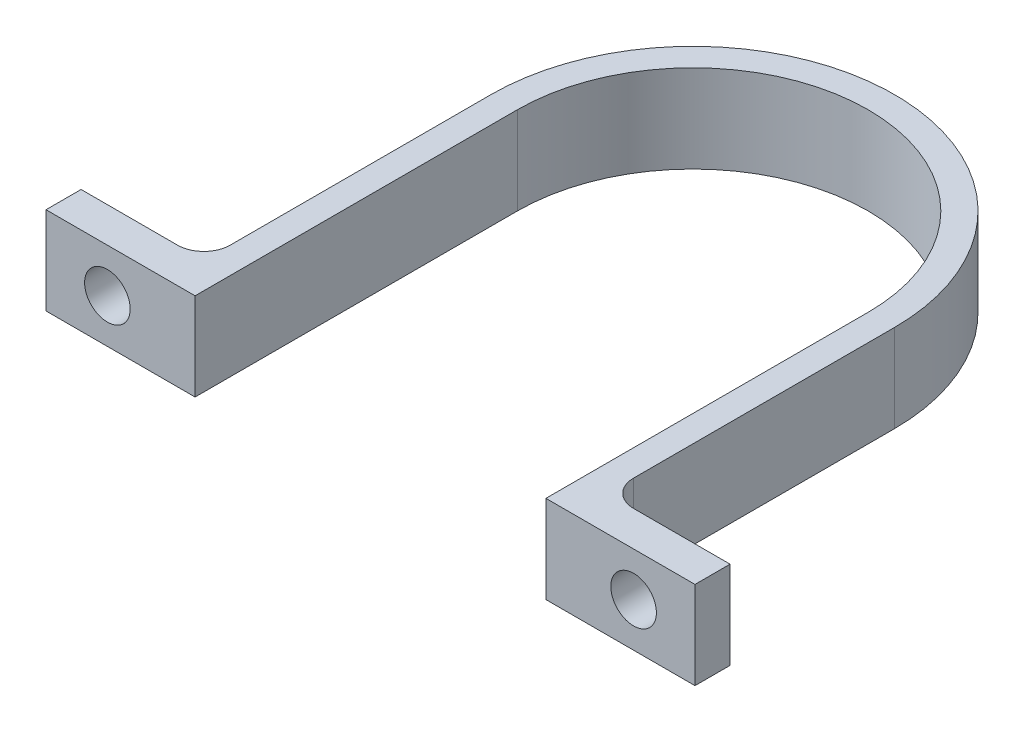
ISO-10303-21;
HEADER;
FILE_DESCRIPTION(('STEP AP214'),'2;1');
FILE_NAME('part.step','',(''),(''),'','','');
FILE_SCHEMA(('AUTOMOTIVE_DESIGN { 1 0 10303 214 1 1 1 1 }'));
ENDSEC;
DATA;
#1=APPLICATION_CONTEXT('core data for automotive mechanical design processes');
#2=APPLICATION_PROTOCOL_DEFINITION('international standard','automotive_design',2000,#1);
#3=PRODUCT_CONTEXT('',#1,'mechanical');
#4=PRODUCT('Part','Part','',(#3));
#5=PRODUCT_RELATED_PRODUCT_CATEGORY('part','',(#4));
#6=PRODUCT_DEFINITION_FORMATION('','',#4);
#7=PRODUCT_DEFINITION_CONTEXT('part definition',#1,'design');
#8=PRODUCT_DEFINITION('design','',#6,#7);
#9=PRODUCT_DEFINITION_SHAPE('','',#8);
#10=(LENGTH_UNIT() NAMED_UNIT(*) SI_UNIT(.MILLI.,.METRE.));
#11=(NAMED_UNIT(*) PLANE_ANGLE_UNIT() SI_UNIT($,.RADIAN.));
#12=(NAMED_UNIT(*) SI_UNIT($,.STERADIAN.) SOLID_ANGLE_UNIT());
#13=UNCERTAINTY_MEASURE_WITH_UNIT(LENGTH_MEASURE(1.E-05),#10,'distance_accuracy_value','');
#14=(GEOMETRIC_REPRESENTATION_CONTEXT(3) GLOBAL_UNCERTAINTY_ASSIGNED_CONTEXT((#13)) GLOBAL_UNIT_ASSIGNED_CONTEXT((#10,
#11,#12)) REPRESENTATION_CONTEXT('',''));
#15=CARTESIAN_POINT('',(0.,0.,0.));
#16=DIRECTION('',(0.,0.,1.));
#17=DIRECTION('',(1.,0.,0.));
#18=AXIS2_PLACEMENT_3D('',#15,#16,#17);
#19=CARTESIAN_POINT('',(23.,10.,0.));
#20=DIRECTION('',(-1.,0.,0.));
#21=DIRECTION('',(0.,0.,1.));
#22=AXIS2_PLACEMENT_3D('',#19,#20,#21);
#23=PLANE('',#22);
#24=DIRECTION('',(0.,0.,-1.));
#25=VECTOR('',#24,1.);
#26=CARTESIAN_POINT('',(23.,10.,0.));
#27=LINE('',#26,#25);
#28=CARTESIAN_POINT('',(23.,10.,29.75));
#29=VERTEX_POINT('',#28);
#30=CARTESIAN_POINT('',(23.,10.,0.));
#31=VERTEX_POINT('',#30);
#32=EDGE_CURVE('E148',#29,#31,#27,.T.);
#33=ORIENTED_EDGE('',*,*,#32,.F.);
#34=DIRECTION('',(0.,-1.,0.));
#35=VECTOR('',#34,1.);
#36=CARTESIAN_POINT('',(23.,0.,29.75));
#37=LINE('',#36,#35);
#38=CARTESIAN_POINT('',(23.,0.,29.75));
#39=VERTEX_POINT('',#38);
#40=EDGE_CURVE('E247',#29,#39,#37,.T.);
#41=ORIENTED_EDGE('',*,*,#40,.T.);
#42=DIRECTION('',(0.,0.,-1.));
#43=VECTOR('',#42,1.);
#44=CARTESIAN_POINT('',(23.,0.,0.));
#45=LINE('',#44,#43);
#46=CARTESIAN_POINT('',(23.,0.,0.));
#47=VERTEX_POINT('',#46);
#48=EDGE_CURVE('E221',#39,#47,#45,.T.);
#49=ORIENTED_EDGE('',*,*,#48,.T.);
#50=DIRECTION('',(0.,-1.,0.));
#51=VECTOR('',#50,1.);
#52=CARTESIAN_POINT('',(23.,10.,0.));
#53=LINE('',#52,#51);
#54=EDGE_CURVE('E239',#31,#47,#53,.T.);
#55=ORIENTED_EDGE('',*,*,#54,.F.);
#56=EDGE_LOOP('',(#33,#41,#49,#55));
#57=FACE_BOUND('',#56,.T.);
#58=ADVANCED_FACE('F38',(#57),#23,.F.);
#59=CARTESIAN_POINT('',(0.,10.,0.));
#60=DIRECTION('',(0.,-1.,0.));
#61=DIRECTION('',(0.,0.,-1.));
#62=AXIS2_PLACEMENT_3D('',#59,#60,#61);
#63=CYLINDRICAL_SURFACE('',#62,20.);
#64=CARTESIAN_POINT('',(0.,0.,0.));
#65=DIRECTION('',(0.,-1.,0.));
#66=DIRECTION('',(0.,0.,1.));
#67=AXIS2_PLACEMENT_3D('',#64,#65,#66);
#68=CIRCLE('',#67,20.);
#69=CARTESIAN_POINT('',(-20.,0.,0.));
#70=VERTEX_POINT('',#69);
#71=CARTESIAN_POINT('',(20.,0.,0.));
#72=VERTEX_POINT('',#71);
#73=EDGE_CURVE('E199',#70,#72,#68,.T.);
#74=ORIENTED_EDGE('',*,*,#73,.T.);
#75=DIRECTION('',(0.,-1.,0.));
#76=VECTOR('',#75,1.);
#77=CARTESIAN_POINT('',(20.,10.,0.));
#78=LINE('',#77,#76);
#79=CARTESIAN_POINT('',(20.,10.,0.));
#80=VERTEX_POINT('',#79);
#81=EDGE_CURVE('E244',#80,#72,#78,.T.);
#82=ORIENTED_EDGE('',*,*,#81,.F.);
#83=CARTESIAN_POINT('',(0.,10.,0.));
#84=DIRECTION('',(0.,-1.,0.));
#85=DIRECTION('',(0.,0.,1.));
#86=AXIS2_PLACEMENT_3D('',#83,#84,#85);
#87=CIRCLE('',#86,20.);
#88=CARTESIAN_POINT('',(-20.,10.,0.));
#89=VERTEX_POINT('',#88);
#90=EDGE_CURVE('E202',#89,#80,#87,.T.);
#91=ORIENTED_EDGE('',*,*,#90,.F.);
#92=DIRECTION('',(0.,-1.,0.));
#93=VECTOR('',#92,1.);
#94=CARTESIAN_POINT('',(-20.,10.,0.));
#95=LINE('',#94,#93);
#96=EDGE_CURVE('E215',#89,#70,#95,.T.);
#97=ORIENTED_EDGE('',*,*,#96,.T.);
#98=EDGE_LOOP('',(#74,#82,#91,#97));
#99=FACE_BOUND('',#98,.T.);
#100=ADVANCED_FACE('F289',(#99),#63,.F.);
#101=CARTESIAN_POINT('',(20.,10.,0.));
#102=DIRECTION('',(1.,0.,0.));
#103=DIRECTION('',(0.,0.,-1.));
#104=AXIS2_PLACEMENT_3D('',#101,#102,#103);
#105=PLANE('',#104);
#106=DIRECTION('',(0.,0.,1.));
#107=VECTOR('',#106,1.);
#108=CARTESIAN_POINT('',(20.,0.,0.));
#109=LINE('',#108,#107);
#110=CARTESIAN_POINT('',(20.,0.,36.75));
#111=VERTEX_POINT('',#110);
#112=EDGE_CURVE('E218',#72,#111,#109,.T.);
#113=ORIENTED_EDGE('',*,*,#112,.T.);
#114=DIRECTION('',(0.,-1.,0.));
#115=VECTOR('',#114,1.);
#116=CARTESIAN_POINT('',(20.,10.,36.75));
#117=LINE('',#116,#115);
#118=CARTESIAN_POINT('',(20.,10.,36.75));
#119=VERTEX_POINT('',#118);
#120=EDGE_CURVE('E242',#119,#111,#117,.T.);
#121=ORIENTED_EDGE('',*,*,#120,.F.);
#122=DIRECTION('',(0.,0.,1.));
#123=VECTOR('',#122,1.);
#124=CARTESIAN_POINT('',(20.,10.,0.));
#125=LINE('',#124,#123);
#126=EDGE_CURVE('E143',#80,#119,#125,.T.);
#127=ORIENTED_EDGE('',*,*,#126,.F.);
#128=ORIENTED_EDGE('',*,*,#81,.T.);
#129=EDGE_LOOP('',(#113,#121,#127,#128));
#130=FACE_BOUND('',#129,.T.);
#131=ADVANCED_FACE('F294',(#130),#105,.F.);
#132=CARTESIAN_POINT('',(20.,10.,36.75));
#133=DIRECTION('',(0.,0.,-1.));
#134=DIRECTION('',(-1.,0.,0.));
#135=AXIS2_PLACEMENT_3D('',#132,#133,#134);
#136=PLANE('',#135);
#137=DIRECTION('',(1.,0.,0.));
#138=VECTOR('',#137,1.);
#139=CARTESIAN_POINT('',(20.,0.,36.75));
#140=LINE('',#139,#138);
#141=CARTESIAN_POINT('',(37.,0.,36.75));
#142=VERTEX_POINT('',#141);
#143=EDGE_CURVE('E163',#111,#142,#140,.T.);
#144=ORIENTED_EDGE('',*,*,#143,.T.);
#145=DIRECTION('',(0.,1.,0.));
#146=VECTOR('',#145,1.);
#147=CARTESIAN_POINT('',(37.,0.,36.75));
#148=LINE('',#147,#146);
#149=CARTESIAN_POINT('',(37.,10.,36.75));
#150=VERTEX_POINT('',#149);
#151=EDGE_CURVE('E154',#142,#150,#148,.T.);
#152=ORIENTED_EDGE('',*,*,#151,.T.);
#153=DIRECTION('',(1.,0.,0.));
#154=VECTOR('',#153,1.);
#155=CARTESIAN_POINT('',(20.,10.,36.75));
#156=LINE('',#155,#154);
#157=EDGE_CURVE('E136',#119,#150,#156,.T.);
#158=ORIENTED_EDGE('',*,*,#157,.F.);
#159=ORIENTED_EDGE('',*,*,#120,.T.);
#160=EDGE_LOOP('',(#144,#152,#158,#159));
#161=FACE_BOUND('',#160,.T.);
#162=CARTESIAN_POINT('',(30.,5.,36.75));
#163=DIRECTION('',(0.,0.,1.));
#164=DIRECTION('',(-1.,0.,0.));
#165=AXIS2_PLACEMENT_3D('',#162,#163,#164);
#166=CIRCLE('',#165,2.6);
#167=CARTESIAN_POINT('',(27.4,5.,36.75));
#168=VERTEX_POINT('',#167);
#169=EDGE_CURVE('E169',#168,#168,#166,.T.);
#170=ORIENTED_EDGE('',*,*,#169,.F.);
#171=EDGE_LOOP('',(#170));
#172=FACE_BOUND('',#171,.T.);
#173=ADVANCED_FACE('F160',(#161,#172),#136,.F.);
#174=CARTESIAN_POINT('',(0.,10.,0.));
#175=DIRECTION('',(0.,-1.,0.));
#176=DIRECTION('',(0.,0.,-1.));
#177=AXIS2_PLACEMENT_3D('',#174,#175,#176);
#178=CYLINDRICAL_SURFACE('',#177,23.);
#179=CARTESIAN_POINT('',(0.,0.,0.));
#180=DIRECTION('',(0.,1.,0.));
#181=DIRECTION('',(0.,0.,1.));
#182=AXIS2_PLACEMENT_3D('',#179,#180,#181);
#183=CIRCLE('',#182,23.);
#184=CARTESIAN_POINT('',(-23.,0.,0.));
#185=VERTEX_POINT('',#184);
#186=EDGE_CURVE('E223',#47,#185,#183,.T.);
#187=ORIENTED_EDGE('',*,*,#186,.T.);
#188=DIRECTION('',(0.,-1.,0.));
#189=VECTOR('',#188,1.);
#190=CARTESIAN_POINT('',(-23.,10.,0.));
#191=LINE('',#190,#189);
#192=CARTESIAN_POINT('',(-23.,10.,0.));
#193=VERTEX_POINT('',#192);
#194=EDGE_CURVE('E236',#193,#185,#191,.T.);
#195=ORIENTED_EDGE('',*,*,#194,.F.);
#196=CARTESIAN_POINT('',(0.,10.,0.));
#197=DIRECTION('',(0.,1.,0.));
#198=DIRECTION('',(0.,0.,1.));
#199=AXIS2_PLACEMENT_3D('',#196,#197,#198);
#200=CIRCLE('',#199,23.);
#201=EDGE_CURVE('E207',#31,#193,#200,.T.);
#202=ORIENTED_EDGE('',*,*,#201,.F.);
#203=ORIENTED_EDGE('',*,*,#54,.T.);
#204=EDGE_LOOP('',(#187,#195,#202,#203));
#205=FACE_BOUND('',#204,.T.);
#206=ADVANCED_FACE('F299',(#205),#178,.T.);
#207=CARTESIAN_POINT('',(-23.,10.,0.));
#208=DIRECTION('',(1.,0.,0.));
#209=DIRECTION('',(0.,0.,-1.));
#210=AXIS2_PLACEMENT_3D('',#207,#208,#209);
#211=PLANE('',#210);
#212=DIRECTION('',(0.,0.,1.));
#213=VECTOR('',#212,1.);
#214=CARTESIAN_POINT('',(-23.,0.,0.));
#215=LINE('',#214,#213);
#216=CARTESIAN_POINT('',(-23.,0.,29.75));
#217=VERTEX_POINT('',#216);
#218=EDGE_CURVE('E225',#185,#217,#215,.T.);
#219=ORIENTED_EDGE('',*,*,#218,.T.);
#220=DIRECTION('',(0.,1.,0.));
#221=VECTOR('',#220,1.);
#222=CARTESIAN_POINT('',(-23.,10.,29.75));
#223=LINE('',#222,#221);
#224=CARTESIAN_POINT('',(-23.,10.,29.75));
#225=VERTEX_POINT('',#224);
#226=EDGE_CURVE('E252',#217,#225,#223,.T.);
#227=ORIENTED_EDGE('',*,*,#226,.T.);
#228=DIRECTION('',(0.,0.,1.));
#229=VECTOR('',#228,1.);
#230=CARTESIAN_POINT('',(-23.,10.,0.));
#231=LINE('',#230,#229);
#232=EDGE_CURVE('E209',#193,#225,#231,.T.);
#233=ORIENTED_EDGE('',*,*,#232,.F.);
#234=ORIENTED_EDGE('',*,*,#194,.T.);
#235=EDGE_LOOP('',(#219,#227,#233,#234));
#236=FACE_BOUND('',#235,.T.);
#237=ADVANCED_FACE('F316',(#236),#211,.F.);
#238=CARTESIAN_POINT('',(-20.,10.,36.75));
#239=DIRECTION('',(0.,0.,-1.));
#240=DIRECTION('',(-1.,0.,0.));
#241=AXIS2_PLACEMENT_3D('',#238,#239,#240);
#242=PLANE('',#241);
#243=DIRECTION('',(1.,0.,0.));
#244=VECTOR('',#243,1.);
#245=CARTESIAN_POINT('',(-20.,0.,36.75));
#246=LINE('',#245,#244);
#247=CARTESIAN_POINT('',(-37.,0.,36.75));
#248=VERTEX_POINT('',#247);
#249=CARTESIAN_POINT('',(-20.,0.,36.75));
#250=VERTEX_POINT('',#249);
#251=EDGE_CURVE('E228',#248,#250,#246,.T.);
#252=ORIENTED_EDGE('',*,*,#251,.T.);
#253=DIRECTION('',(0.,-1.,0.));
#254=VECTOR('',#253,1.);
#255=CARTESIAN_POINT('',(-20.,10.,36.75));
#256=LINE('',#255,#254);
#257=CARTESIAN_POINT('',(-20.,10.,36.75));
#258=VERTEX_POINT('',#257);
#259=EDGE_CURVE('E233',#258,#250,#256,.T.);
#260=ORIENTED_EDGE('',*,*,#259,.F.);
#261=DIRECTION('',(1.,0.,0.));
#262=VECTOR('',#261,1.);
#263=CARTESIAN_POINT('',(-20.,10.,36.75));
#264=LINE('',#263,#262);
#265=CARTESIAN_POINT('',(-37.,10.,36.75));
#266=VERTEX_POINT('',#265);
#267=EDGE_CURVE('E211',#266,#258,#264,.T.);
#268=ORIENTED_EDGE('',*,*,#267,.F.);
#269=DIRECTION('',(0.,-1.,0.));
#270=VECTOR('',#269,1.);
#271=CARTESIAN_POINT('',(-37.,0.,36.75));
#272=LINE('',#271,#270);
#273=EDGE_CURVE('E183',#266,#248,#272,.T.);
#274=ORIENTED_EDGE('',*,*,#273,.T.);
#275=EDGE_LOOP('',(#252,#260,#268,#274));
#276=FACE_BOUND('',#275,.T.);
#277=CARTESIAN_POINT('',(-30.,5.,36.75));
#278=DIRECTION('',(0.,0.,1.));
#279=DIRECTION('',(1.,0.,0.));
#280=AXIS2_PLACEMENT_3D('',#277,#278,#279);
#281=CIRCLE('',#280,2.6);
#282=CARTESIAN_POINT('',(-27.4,5.,36.75));
#283=VERTEX_POINT('',#282);
#284=EDGE_CURVE('E178',#283,#283,#281,.T.);
#285=ORIENTED_EDGE('',*,*,#284,.F.);
#286=EDGE_LOOP('',(#285));
#287=FACE_BOUND('',#286,.T.);
#288=ADVANCED_FACE('F324',(#276,#287),#242,.F.);
#289=CARTESIAN_POINT('',(-20.,10.,0.));
#290=DIRECTION('',(-1.,0.,0.));
#291=DIRECTION('',(0.,0.,1.));
#292=AXIS2_PLACEMENT_3D('',#289,#290,#291);
#293=PLANE('',#292);
#294=DIRECTION('',(0.,0.,-1.));
#295=VECTOR('',#294,1.);
#296=CARTESIAN_POINT('',(-20.,0.,0.));
#297=LINE('',#296,#295);
#298=EDGE_CURVE('E204',#250,#70,#297,.T.);
#299=ORIENTED_EDGE('',*,*,#298,.T.);
#300=ORIENTED_EDGE('',*,*,#96,.F.);
#301=DIRECTION('',(0.,0.,-1.));
#302=VECTOR('',#301,1.);
#303=CARTESIAN_POINT('',(-20.,10.,0.));
#304=LINE('',#303,#302);
#305=EDGE_CURVE('E213',#258,#89,#304,.T.);
#306=ORIENTED_EDGE('',*,*,#305,.F.);
#307=ORIENTED_EDGE('',*,*,#259,.T.);
#308=EDGE_LOOP('',(#299,#300,#306,#307));
#309=FACE_BOUND('',#308,.T.);
#310=ADVANCED_FACE('F328',(#309),#293,.F.);
#311=CARTESIAN_POINT('',(0.,10.,0.));
#312=DIRECTION('',(0.,1.,0.));
#313=DIRECTION('',(0.,0.,1.));
#314=AXIS2_PLACEMENT_3D('',#311,#312,#313);
#315=PLANE('',#314);
#316=ORIENTED_EDGE('',*,*,#90,.T.);
#317=ORIENTED_EDGE('',*,*,#126,.T.);
#318=ORIENTED_EDGE('',*,*,#157,.T.);
#319=DIRECTION('',(0.,0.,1.));
#320=VECTOR('',#319,1.);
#321=CARTESIAN_POINT('',(37.,10.,32.75));
#322=LINE('',#321,#320);
#323=CARTESIAN_POINT('',(37.,10.,32.75));
#324=VERTEX_POINT('',#323);
#325=EDGE_CURVE('E141',#324,#150,#322,.T.);
#326=ORIENTED_EDGE('',*,*,#325,.F.);
#327=DIRECTION('',(-1.,0.,0.));
#328=VECTOR('',#327,1.);
#329=CARTESIAN_POINT('',(37.,10.,32.75));
#330=LINE('',#329,#328);
#331=CARTESIAN_POINT('',(26.,10.,32.75));
#332=VERTEX_POINT('',#331);
#333=EDGE_CURVE('E174',#324,#332,#330,.T.);
#334=ORIENTED_EDGE('',*,*,#333,.T.);
#335=CARTESIAN_POINT('',(26.,10.,29.75));
#336=DIRECTION('',(0.,1.,0.));
#337=DIRECTION('',(0.,0.,1.));
#338=AXIS2_PLACEMENT_3D('',#335,#336,#337);
#339=CIRCLE('',#338,3.);
#340=EDGE_CURVE('E258',#332,#29,#339,.F.);
#341=ORIENTED_EDGE('',*,*,#340,.T.);
#342=ORIENTED_EDGE('',*,*,#32,.T.);
#343=ORIENTED_EDGE('',*,*,#201,.T.);
#344=ORIENTED_EDGE('',*,*,#232,.T.);
#345=CARTESIAN_POINT('',(-26.,10.,29.75));
#346=DIRECTION('',(0.,1.,0.));
#347=DIRECTION('',(0.,0.,1.));
#348=AXIS2_PLACEMENT_3D('',#345,#346,#347);
#349=CIRCLE('',#348,3.);
#350=CARTESIAN_POINT('',(-26.,10.,32.75));
#351=VERTEX_POINT('',#350);
#352=EDGE_CURVE('E46',#225,#351,#349,.F.);
#353=ORIENTED_EDGE('',*,*,#352,.T.);
#354=DIRECTION('',(-1.,0.,0.));
#355=VECTOR('',#354,1.);
#356=CARTESIAN_POINT('',(-37.,10.,32.75));
#357=LINE('',#356,#355);
#358=CARTESIAN_POINT('',(-37.,10.,32.75));
#359=VERTEX_POINT('',#358);
#360=EDGE_CURVE('E186',#351,#359,#357,.T.);
#361=ORIENTED_EDGE('',*,*,#360,.T.);
#362=DIRECTION('',(0.,0.,1.));
#363=VECTOR('',#362,1.);
#364=CARTESIAN_POINT('',(-37.,10.,32.75));
#365=LINE('',#364,#363);
#366=EDGE_CURVE('E193',#359,#266,#365,.T.);
#367=ORIENTED_EDGE('',*,*,#366,.T.);
#368=ORIENTED_EDGE('',*,*,#267,.T.);
#369=ORIENTED_EDGE('',*,*,#305,.T.);
#370=EDGE_LOOP('',(#316,#317,#318,#326,#334,#341,#342,#343,#344,#353,#361,#367,#368,#369));
#371=FACE_BOUND('',#370,.T.);
#372=ADVANCED_FACE('F139',(#371),#315,.T.);
#373=CARTESIAN_POINT('',(0.,0.,0.));
#374=DIRECTION('',(0.,1.,0.));
#375=DIRECTION('',(0.,0.,1.));
#376=AXIS2_PLACEMENT_3D('',#373,#374,#375);
#377=PLANE('',#376);
#378=ORIENTED_EDGE('',*,*,#73,.F.);
#379=ORIENTED_EDGE('',*,*,#298,.F.);
#380=ORIENTED_EDGE('',*,*,#251,.F.);
#381=DIRECTION('',(0.,0.,1.));
#382=VECTOR('',#381,1.);
#383=CARTESIAN_POINT('',(-37.,0.,32.75));
#384=LINE('',#383,#382);
#385=CARTESIAN_POINT('',(-37.,0.,32.75));
#386=VERTEX_POINT('',#385);
#387=EDGE_CURVE('E196',#386,#248,#384,.T.);
#388=ORIENTED_EDGE('',*,*,#387,.F.);
#389=DIRECTION('',(1.,0.,0.));
#390=VECTOR('',#389,1.);
#391=CARTESIAN_POINT('',(-37.,0.,32.75));
#392=LINE('',#391,#390);
#393=CARTESIAN_POINT('',(-26.,0.,32.75));
#394=VERTEX_POINT('',#393);
#395=EDGE_CURVE('E191',#386,#394,#392,.T.);
#396=ORIENTED_EDGE('',*,*,#395,.T.);
#397=CARTESIAN_POINT('',(-26.,0.,29.75));
#398=DIRECTION('',(0.,1.,0.));
#399=DIRECTION('',(0.,0.,1.));
#400=AXIS2_PLACEMENT_3D('',#397,#398,#399);
#401=CIRCLE('',#400,3.);
#402=EDGE_CURVE('E11',#394,#217,#401,.T.);
#403=ORIENTED_EDGE('',*,*,#402,.T.);
#404=ORIENTED_EDGE('',*,*,#218,.F.);
#405=ORIENTED_EDGE('',*,*,#186,.F.);
#406=ORIENTED_EDGE('',*,*,#48,.F.);
#407=CARTESIAN_POINT('',(26.,0.,29.75));
#408=DIRECTION('',(0.,1.,0.));
#409=DIRECTION('',(0.,0.,1.));
#410=AXIS2_PLACEMENT_3D('',#407,#408,#409);
#411=CIRCLE('',#410,3.);
#412=CARTESIAN_POINT('',(26.,0.,32.75));
#413=VERTEX_POINT('',#412);
#414=EDGE_CURVE('E256',#39,#413,#411,.T.);
#415=ORIENTED_EDGE('',*,*,#414,.T.);
#416=DIRECTION('',(1.,0.,0.));
#417=VECTOR('',#416,1.);
#418=CARTESIAN_POINT('',(37.,0.,32.75));
#419=LINE('',#418,#417);
#420=CARTESIAN_POINT('',(37.,0.,32.75));
#421=VERTEX_POINT('',#420);
#422=EDGE_CURVE('E166',#413,#421,#419,.T.);
#423=ORIENTED_EDGE('',*,*,#422,.T.);
#424=DIRECTION('',(0.,0.,1.));
#425=VECTOR('',#424,1.);
#426=CARTESIAN_POINT('',(37.,0.,32.75));
#427=LINE('',#426,#425);
#428=EDGE_CURVE('E158',#421,#142,#427,.T.);
#429=ORIENTED_EDGE('',*,*,#428,.T.);
#430=ORIENTED_EDGE('',*,*,#143,.F.);
#431=ORIENTED_EDGE('',*,*,#112,.F.);
#432=EDGE_LOOP('',(#378,#379,#380,#388,#396,#403,#404,#405,#406,#415,#423,#429,#430,#431));
#433=FACE_BOUND('',#432,.T.);
#434=ADVANCED_FACE('F272',(#433),#377,.F.);
#435=CARTESIAN_POINT('',(-37.,0.,32.75));
#436=DIRECTION('',(-1.,0.,0.));
#437=DIRECTION('',(0.,0.,1.));
#438=AXIS2_PLACEMENT_3D('',#435,#436,#437);
#439=PLANE('',#438);
#440=ORIENTED_EDGE('',*,*,#273,.F.);
#441=ORIENTED_EDGE('',*,*,#366,.F.);
#442=DIRECTION('',(0.,-1.,0.));
#443=VECTOR('',#442,1.);
#444=CARTESIAN_POINT('',(-37.,0.,32.75));
#445=LINE('',#444,#443);
#446=EDGE_CURVE('E188',#359,#386,#445,.T.);
#447=ORIENTED_EDGE('',*,*,#446,.T.);
#448=ORIENTED_EDGE('',*,*,#387,.T.);
#449=EDGE_LOOP('',(#440,#441,#447,#448));
#450=FACE_BOUND('',#449,.T.);
#451=ADVANCED_FACE('F337',(#450),#439,.T.);
#452=CARTESIAN_POINT('',(0.,0.,32.75));
#453=DIRECTION('',(0.,0.,-1.));
#454=DIRECTION('',(-1.,0.,0.));
#455=AXIS2_PLACEMENT_3D('',#452,#453,#454);
#456=PLANE('',#455);
#457=CARTESIAN_POINT('',(-30.,5.,32.75));
#458=DIRECTION('',(0.,0.,1.));
#459=DIRECTION('',(1.,0.,0.));
#460=AXIS2_PLACEMENT_3D('',#457,#458,#459);
#461=CIRCLE('',#460,2.6);
#462=CARTESIAN_POINT('',(-27.4,5.,32.75));
#463=VERTEX_POINT('',#462);
#464=EDGE_CURVE('E180',#463,#463,#461,.T.);
#465=ORIENTED_EDGE('',*,*,#464,.T.);
#466=EDGE_LOOP('',(#465));
#467=FACE_BOUND('',#466,.T.);
#468=ORIENTED_EDGE('',*,*,#360,.F.);
#469=DIRECTION('',(0.,1.,0.));
#470=VECTOR('',#469,1.);
#471=CARTESIAN_POINT('',(-26.,0.,32.75));
#472=LINE('',#471,#470);
#473=EDGE_CURVE('E59',#351,#394,#472,.F.);
#474=ORIENTED_EDGE('',*,*,#473,.T.);
#475=ORIENTED_EDGE('',*,*,#395,.F.);
#476=ORIENTED_EDGE('',*,*,#446,.F.);
#477=EDGE_LOOP('',(#468,#474,#475,#476));
#478=FACE_BOUND('',#477,.T.);
#479=ADVANCED_FACE('F342',(#467,#478),#456,.T.);
#480=CARTESIAN_POINT('',(-30.,5.,32.75));
#481=DIRECTION('',(0.,0.,1.));
#482=DIRECTION('',(1.,0.,0.));
#483=AXIS2_PLACEMENT_3D('',#480,#481,#482);
#484=CYLINDRICAL_SURFACE('',#483,2.6);
#485=ORIENTED_EDGE('',*,*,#464,.F.);
#486=EDGE_LOOP('',(#485));
#487=FACE_BOUND('',#486,.T.);
#488=ORIENTED_EDGE('',*,*,#284,.T.);
#489=EDGE_LOOP('',(#488));
#490=FACE_BOUND('',#489,.T.);
#491=ADVANCED_FACE('F286',(#487,#490),#484,.F.);
#492=CARTESIAN_POINT('',(37.,0.,32.75));
#493=DIRECTION('',(1.,0.,0.));
#494=DIRECTION('',(0.,0.,-1.));
#495=AXIS2_PLACEMENT_3D('',#492,#493,#494);
#496=PLANE('',#495);
#497=ORIENTED_EDGE('',*,*,#151,.F.);
#498=ORIENTED_EDGE('',*,*,#428,.F.);
#499=DIRECTION('',(0.,1.,0.));
#500=VECTOR('',#499,1.);
#501=CARTESIAN_POINT('',(37.,0.,32.75));
#502=LINE('',#501,#500);
#503=EDGE_CURVE('E156',#421,#324,#502,.T.);
#504=ORIENTED_EDGE('',*,*,#503,.T.);
#505=ORIENTED_EDGE('',*,*,#325,.T.);
#506=EDGE_LOOP('',(#497,#498,#504,#505));
#507=FACE_BOUND('',#506,.T.);
#508=ADVANCED_FACE('F152',(#507),#496,.T.);
#509=CARTESIAN_POINT('',(0.,0.,32.75));
#510=DIRECTION('',(0.,0.,1.));
#511=DIRECTION('',(1.,0.,0.));
#512=AXIS2_PLACEMENT_3D('',#509,#510,#511);
#513=PLANE('',#512);
#514=CARTESIAN_POINT('',(30.,5.,32.75));
#515=DIRECTION('',(0.,0.,1.));
#516=DIRECTION('',(-1.,0.,0.));
#517=AXIS2_PLACEMENT_3D('',#514,#515,#516);
#518=CIRCLE('',#517,2.6);
#519=CARTESIAN_POINT('',(27.4,5.,32.75));
#520=VERTEX_POINT('',#519);
#521=EDGE_CURVE('E165',#520,#520,#518,.T.);
#522=ORIENTED_EDGE('',*,*,#521,.T.);
#523=EDGE_LOOP('',(#522));
#524=FACE_BOUND('',#523,.T.);
#525=ORIENTED_EDGE('',*,*,#422,.F.);
#526=DIRECTION('',(0.,-1.,0.));
#527=VECTOR('',#526,1.);
#528=CARTESIAN_POINT('',(26.,10.,32.75));
#529=LINE('',#528,#527);
#530=EDGE_CURVE('E250',#413,#332,#529,.F.);
#531=ORIENTED_EDGE('',*,*,#530,.T.);
#532=ORIENTED_EDGE('',*,*,#333,.F.);
#533=ORIENTED_EDGE('',*,*,#503,.F.);
#534=EDGE_LOOP('',(#525,#531,#532,#533));
#535=FACE_BOUND('',#534,.T.);
#536=ADVANCED_FACE('F275',(#524,#535),#513,.F.);
#537=CARTESIAN_POINT('',(30.,5.,32.75));
#538=DIRECTION('',(0.,0.,1.));
#539=DIRECTION('',(1.,0.,0.));
#540=AXIS2_PLACEMENT_3D('',#537,#538,#539);
#541=CYLINDRICAL_SURFACE('',#540,2.6);
#542=ORIENTED_EDGE('',*,*,#521,.F.);
#543=EDGE_LOOP('',(#542));
#544=FACE_BOUND('',#543,.T.);
#545=ORIENTED_EDGE('',*,*,#169,.T.);
#546=EDGE_LOOP('',(#545));
#547=FACE_BOUND('',#546,.T.);
#548=ADVANCED_FACE('F277',(#544,#547),#541,.F.);
#549=CARTESIAN_POINT('',(26.,10.,29.75));
#550=DIRECTION('',(0.,1.,0.));
#551=DIRECTION('',(0.,0.,1.));
#552=AXIS2_PLACEMENT_3D('',#549,#550,#551);
#553=CYLINDRICAL_SURFACE('',#552,3.);
#554=ORIENTED_EDGE('',*,*,#340,.F.);
#555=ORIENTED_EDGE('',*,*,#530,.F.);
#556=ORIENTED_EDGE('',*,*,#414,.F.);
#557=ORIENTED_EDGE('',*,*,#40,.F.);
#558=EDGE_LOOP('',(#554,#555,#556,#557));
#559=FACE_BOUND('',#558,.T.);
#560=ADVANCED_FACE('F268',(#559),#553,.F.);
#561=CARTESIAN_POINT('',(-26.,10.,29.75));
#562=DIRECTION('',(0.,1.,0.));
#563=DIRECTION('',(0.,0.,1.));
#564=AXIS2_PLACEMENT_3D('',#561,#562,#563);
#565=CYLINDRICAL_SURFACE('',#564,3.);
#566=ORIENTED_EDGE('',*,*,#402,.F.);
#567=ORIENTED_EDGE('',*,*,#473,.F.);
#568=ORIENTED_EDGE('',*,*,#352,.F.);
#569=ORIENTED_EDGE('',*,*,#226,.F.);
#570=EDGE_LOOP('',(#566,#567,#568,#569));
#571=FACE_BOUND('',#570,.T.);
#572=ADVANCED_FACE('F40',(#571),#565,.F.);
#573=CLOSED_SHELL('',(#58,#100,#131,#173,#206,#237,#288,#310,#372,#434,#451,#479,#491,#508,#536,
#548,#560,#572));
#574=MANIFOLD_SOLID_BREP('B2',#573);
#575=ADVANCED_BREP_SHAPE_REPRESENTATION('',(#18,#574),#14);
#576=SHAPE_DEFINITION_REPRESENTATION(#9,#575);
ENDSEC;
END-ISO-10303-21;
